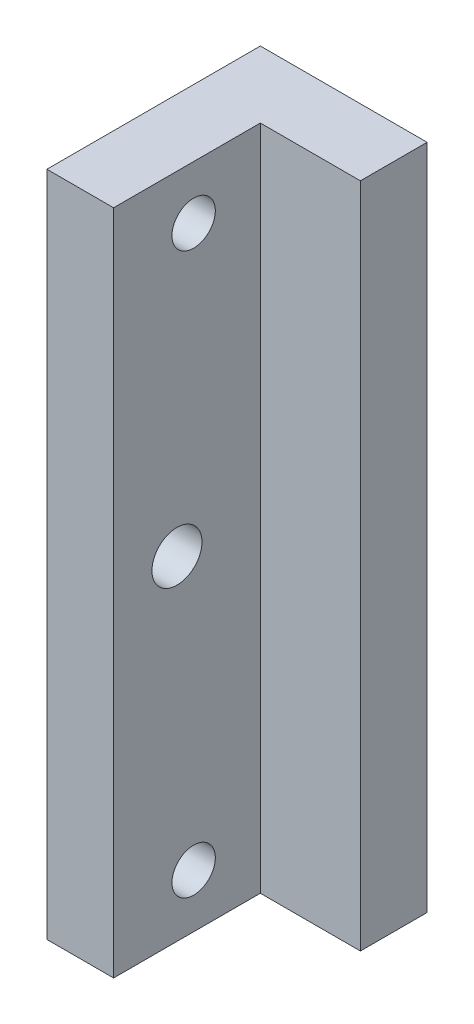
ISO-10303-21;
HEADER;
FILE_DESCRIPTION(('STEP AP214'),'2;1');
FILE_NAME('part.step','',(''),(''),'','','');
FILE_SCHEMA(('AUTOMOTIVE_DESIGN { 1 0 10303 214 1 1 1 1 }'));
ENDSEC;
DATA;
#1=APPLICATION_CONTEXT('core data for automotive mechanical design processes');
#2=APPLICATION_PROTOCOL_DEFINITION('international standard','automotive_design',2000,#1);
#3=PRODUCT_CONTEXT('',#1,'mechanical');
#4=PRODUCT('Part','Part','',(#3));
#5=PRODUCT_RELATED_PRODUCT_CATEGORY('part','',(#4));
#6=PRODUCT_DEFINITION_FORMATION('','',#4);
#7=PRODUCT_DEFINITION_CONTEXT('part definition',#1,'design');
#8=PRODUCT_DEFINITION('design','',#6,#7);
#9=PRODUCT_DEFINITION_SHAPE('','',#8);
#10=(LENGTH_UNIT() NAMED_UNIT(*) SI_UNIT(.MILLI.,.METRE.));
#11=(NAMED_UNIT(*) PLANE_ANGLE_UNIT() SI_UNIT($,.RADIAN.));
#12=(NAMED_UNIT(*) SI_UNIT($,.STERADIAN.) SOLID_ANGLE_UNIT());
#13=UNCERTAINTY_MEASURE_WITH_UNIT(LENGTH_MEASURE(1.E-05),#10,'distance_accuracy_value','');
#14=(GEOMETRIC_REPRESENTATION_CONTEXT(3) GLOBAL_UNCERTAINTY_ASSIGNED_CONTEXT((#13)) GLOBAL_UNIT_ASSIGNED_CONTEXT((#10,
#11,#12)) REPRESENTATION_CONTEXT('',''));
#15=CARTESIAN_POINT('',(0.,0.,0.));
#16=DIRECTION('',(0.,0.,1.));
#17=DIRECTION('',(1.,0.,0.));
#18=AXIS2_PLACEMENT_3D('',#15,#16,#17);
#19=CARTESIAN_POINT('',(25.,50.,10.));
#20=DIRECTION('',(-1.,0.,0.));
#21=DIRECTION('',(0.,0.,1.));
#22=AXIS2_PLACEMENT_3D('',#19,#20,#21);
#23=PLANE('',#22);
#24=DIRECTION('',(0.,0.,-1.));
#25=VECTOR('',#24,1.);
#26=CARTESIAN_POINT('',(25.,-50.,10.));
#27=LINE('',#26,#25);
#28=CARTESIAN_POINT('',(25.,-50.,10.));
#29=VERTEX_POINT('',#28);
#30=CARTESIAN_POINT('',(25.,-50.,0.));
#31=VERTEX_POINT('',#30);
#32=EDGE_CURVE('E118',#29,#31,#27,.T.);
#33=ORIENTED_EDGE('',*,*,#32,.T.);
#34=DIRECTION('',(0.,-1.,0.));
#35=VECTOR('',#34,1.);
#36=CARTESIAN_POINT('',(25.,50.,0.));
#37=LINE('',#36,#35);
#38=CARTESIAN_POINT('',(25.,50.,0.));
#39=VERTEX_POINT('',#38);
#40=EDGE_CURVE('E11',#39,#31,#37,.T.);
#41=ORIENTED_EDGE('',*,*,#40,.F.);
#42=DIRECTION('',(0.,0.,-1.));
#43=VECTOR('',#42,1.);
#44=CARTESIAN_POINT('',(25.,50.,10.));
#45=LINE('',#44,#43);
#46=CARTESIAN_POINT('',(25.,50.,10.));
#47=VERTEX_POINT('',#46);
#48=EDGE_CURVE('E129',#47,#39,#45,.T.);
#49=ORIENTED_EDGE('',*,*,#48,.F.);
#50=DIRECTION('',(0.,-1.,0.));
#51=VECTOR('',#50,1.);
#52=CARTESIAN_POINT('',(25.,50.,10.));
#53=LINE('',#52,#51);
#54=EDGE_CURVE('E114',#47,#29,#53,.T.);
#55=ORIENTED_EDGE('',*,*,#54,.T.);
#56=EDGE_LOOP('',(#33,#41,#49,#55));
#57=FACE_BOUND('',#56,.T.);
#58=ADVANCED_FACE('F32',(#57),#23,.F.);
#59=CARTESIAN_POINT('',(25.,50.,0.));
#60=DIRECTION('',(0.,0.,1.));
#61=DIRECTION('',(1.,0.,0.));
#62=AXIS2_PLACEMENT_3D('',#59,#60,#61);
#63=PLANE('',#62);
#64=DIRECTION('',(-1.,0.,0.));
#65=VECTOR('',#64,1.);
#66=CARTESIAN_POINT('',(25.,-50.,0.));
#67=LINE('',#66,#65);
#68=CARTESIAN_POINT('',(0.,-50.,0.));
#69=VERTEX_POINT('',#68);
#70=EDGE_CURVE('E121',#31,#69,#67,.T.);
#71=ORIENTED_EDGE('',*,*,#70,.T.);
#72=DIRECTION('',(0.,-1.,0.));
#73=VECTOR('',#72,1.);
#74=CARTESIAN_POINT('',(0.,50.,0.));
#75=LINE('',#74,#73);
#76=CARTESIAN_POINT('',(0.,50.,0.));
#77=VERTEX_POINT('',#76);
#78=EDGE_CURVE('E41',#77,#69,#75,.T.);
#79=ORIENTED_EDGE('',*,*,#78,.F.);
#80=DIRECTION('',(-1.,0.,0.));
#81=VECTOR('',#80,1.);
#82=CARTESIAN_POINT('',(25.,50.,0.));
#83=LINE('',#82,#81);
#84=EDGE_CURVE('E87',#39,#77,#83,.T.);
#85=ORIENTED_EDGE('',*,*,#84,.F.);
#86=ORIENTED_EDGE('',*,*,#40,.T.);
#87=EDGE_LOOP('',(#71,#79,#85,#86));
#88=FACE_BOUND('',#87,.T.);
#89=ADVANCED_FACE('F155',(#88),#63,.F.);
#90=CARTESIAN_POINT('',(0.,50.,0.));
#91=DIRECTION('',(1.,0.,0.));
#92=DIRECTION('',(0.,0.,-1.));
#93=AXIS2_PLACEMENT_3D('',#90,#91,#92);
#94=PLANE('',#93);
#95=CARTESIAN_POINT('',(0.,0.,22.5));
#96=DIRECTION('',(-1.,0.,0.));
#97=DIRECTION('',(0.,0.,1.));
#98=AXIS2_PLACEMENT_3D('',#95,#96,#97);
#99=CIRCLE('',#98,3.75);
#100=CARTESIAN_POINT('',(0.,0.,26.25));
#101=VERTEX_POINT('',#100);
#102=EDGE_CURVE('E149',#101,#101,#99,.T.);
#103=ORIENTED_EDGE('',*,*,#102,.F.);
#104=EDGE_LOOP('',(#103));
#105=FACE_BOUND('',#104,.T.);
#106=CARTESIAN_POINT('',(0.,-42.,20.));
#107=DIRECTION('',(-1.,0.,0.));
#108=DIRECTION('',(0.,0.,1.));
#109=AXIS2_PLACEMENT_3D('',#106,#107,#108);
#110=CIRCLE('',#109,3.24999999999999);
#111=CARTESIAN_POINT('',(0.,-42.,23.25));
#112=VERTEX_POINT('',#111);
#113=EDGE_CURVE('E139',#112,#112,#110,.T.);
#114=ORIENTED_EDGE('',*,*,#113,.F.);
#115=EDGE_LOOP('',(#114));
#116=FACE_BOUND('',#115,.T.);
#117=CARTESIAN_POINT('',(0.,42.,20.));
#118=DIRECTION('',(-1.,0.,0.));
#119=DIRECTION('',(0.,0.,1.));
#120=AXIS2_PLACEMENT_3D('',#117,#118,#119);
#121=CIRCLE('',#120,3.24999999999999);
#122=CARTESIAN_POINT('',(0.,42.,23.25));
#123=VERTEX_POINT('',#122);
#124=EDGE_CURVE('E136',#123,#123,#121,.T.);
#125=ORIENTED_EDGE('',*,*,#124,.F.);
#126=EDGE_LOOP('',(#125));
#127=FACE_BOUND('',#126,.T.);
#128=DIRECTION('',(0.,0.,1.));
#129=VECTOR('',#128,1.);
#130=CARTESIAN_POINT('',(0.,-50.,0.));
#131=LINE('',#130,#129);
#132=CARTESIAN_POINT('',(0.,-50.,32.));
#133=VERTEX_POINT('',#132);
#134=EDGE_CURVE('E124',#69,#133,#131,.T.);
#135=ORIENTED_EDGE('',*,*,#134,.T.);
#136=DIRECTION('',(0.,-1.,0.));
#137=VECTOR('',#136,1.);
#138=CARTESIAN_POINT('',(0.,50.,32.));
#139=LINE('',#138,#137);
#140=CARTESIAN_POINT('',(0.,50.,32.));
#141=VERTEX_POINT('',#140);
#142=EDGE_CURVE('E109',#141,#133,#139,.T.);
#143=ORIENTED_EDGE('',*,*,#142,.F.);
#144=DIRECTION('',(0.,0.,1.));
#145=VECTOR('',#144,1.);
#146=CARTESIAN_POINT('',(0.,50.,0.));
#147=LINE('',#146,#145);
#148=EDGE_CURVE('E100',#77,#141,#147,.T.);
#149=ORIENTED_EDGE('',*,*,#148,.F.);
#150=ORIENTED_EDGE('',*,*,#78,.T.);
#151=EDGE_LOOP('',(#135,#143,#149,#150));
#152=FACE_BOUND('',#151,.T.);
#153=ADVANCED_FACE('F158',(#105,#116,#127,#152),#94,.F.);
#154=CARTESIAN_POINT('',(0.,50.,32.));
#155=DIRECTION('',(0.,0.,-1.));
#156=DIRECTION('',(-1.,0.,0.));
#157=AXIS2_PLACEMENT_3D('',#154,#155,#156);
#158=PLANE('',#157);
#159=DIRECTION('',(1.,0.,0.));
#160=VECTOR('',#159,1.);
#161=CARTESIAN_POINT('',(0.,-50.,32.));
#162=LINE('',#161,#160);
#163=CARTESIAN_POINT('',(10.,-50.,32.));
#164=VERTEX_POINT('',#163);
#165=EDGE_CURVE('E108',#133,#164,#162,.T.);
#166=ORIENTED_EDGE('',*,*,#165,.T.);
#167=DIRECTION('',(0.,-1.,0.));
#168=VECTOR('',#167,1.);
#169=CARTESIAN_POINT('',(10.,50.,32.));
#170=LINE('',#169,#168);
#171=CARTESIAN_POINT('',(10.,50.,32.));
#172=VERTEX_POINT('',#171);
#173=EDGE_CURVE('E105',#172,#164,#170,.T.);
#174=ORIENTED_EDGE('',*,*,#173,.F.);
#175=DIRECTION('',(1.,0.,0.));
#176=VECTOR('',#175,1.);
#177=CARTESIAN_POINT('',(0.,50.,32.));
#178=LINE('',#177,#176);
#179=EDGE_CURVE('E94',#141,#172,#178,.T.);
#180=ORIENTED_EDGE('',*,*,#179,.F.);
#181=ORIENTED_EDGE('',*,*,#142,.T.);
#182=EDGE_LOOP('',(#166,#174,#180,#181));
#183=FACE_BOUND('',#182,.T.);
#184=ADVANCED_FACE('F106',(#183),#158,.F.);
#185=CARTESIAN_POINT('',(10.,50.,32.));
#186=DIRECTION('',(-1.,0.,0.));
#187=DIRECTION('',(0.,0.,1.));
#188=AXIS2_PLACEMENT_3D('',#185,#186,#187);
#189=PLANE('',#188);
#190=CARTESIAN_POINT('',(10.,0.,22.5));
#191=DIRECTION('',(-1.,0.,0.));
#192=DIRECTION('',(0.,0.,1.));
#193=AXIS2_PLACEMENT_3D('',#190,#191,#192);
#194=CIRCLE('',#193,3.75);
#195=CARTESIAN_POINT('',(10.,0.,26.25));
#196=VERTEX_POINT('',#195);
#197=EDGE_CURVE('E35',#196,#196,#194,.T.);
#198=ORIENTED_EDGE('',*,*,#197,.T.);
#199=EDGE_LOOP('',(#198));
#200=FACE_BOUND('',#199,.T.);
#201=CARTESIAN_POINT('',(10.,-42.,20.));
#202=DIRECTION('',(-1.,0.,0.));
#203=DIRECTION('',(0.,0.,1.));
#204=AXIS2_PLACEMENT_3D('',#201,#202,#203);
#205=CIRCLE('',#204,3.24999999999999);
#206=CARTESIAN_POINT('',(10.,-42.,23.25));
#207=VERTEX_POINT('',#206);
#208=EDGE_CURVE('E137',#207,#207,#205,.T.);
#209=ORIENTED_EDGE('',*,*,#208,.T.);
#210=EDGE_LOOP('',(#209));
#211=FACE_BOUND('',#210,.T.);
#212=CARTESIAN_POINT('',(10.,42.,20.));
#213=DIRECTION('',(-1.,0.,0.));
#214=DIRECTION('',(0.,0.,1.));
#215=AXIS2_PLACEMENT_3D('',#212,#213,#214);
#216=CIRCLE('',#215,3.24999999999999);
#217=CARTESIAN_POINT('',(10.,42.,23.25));
#218=VERTEX_POINT('',#217);
#219=EDGE_CURVE('E122',#218,#218,#216,.T.);
#220=ORIENTED_EDGE('',*,*,#219,.T.);
#221=EDGE_LOOP('',(#220));
#222=FACE_BOUND('',#221,.T.);
#223=DIRECTION('',(0.,0.,-1.));
#224=VECTOR('',#223,1.);
#225=CARTESIAN_POINT('',(10.,-50.,32.));
#226=LINE('',#225,#224);
#227=CARTESIAN_POINT('',(10.,-50.,10.));
#228=VERTEX_POINT('',#227);
#229=EDGE_CURVE('E73',#164,#228,#226,.T.);
#230=ORIENTED_EDGE('',*,*,#229,.T.);
#231=DIRECTION('',(0.,-1.,0.));
#232=VECTOR('',#231,1.);
#233=CARTESIAN_POINT('',(10.,50.,10.));
#234=LINE('',#233,#232);
#235=CARTESIAN_POINT('',(10.,50.,10.));
#236=VERTEX_POINT('',#235);
#237=EDGE_CURVE('E110',#236,#228,#234,.T.);
#238=ORIENTED_EDGE('',*,*,#237,.F.);
#239=DIRECTION('',(0.,0.,-1.));
#240=VECTOR('',#239,1.);
#241=CARTESIAN_POINT('',(10.,50.,32.));
#242=LINE('',#241,#240);
#243=EDGE_CURVE('E98',#172,#236,#242,.T.);
#244=ORIENTED_EDGE('',*,*,#243,.F.);
#245=ORIENTED_EDGE('',*,*,#173,.T.);
#246=EDGE_LOOP('',(#230,#238,#244,#245));
#247=FACE_BOUND('',#246,.T.);
#248=ADVANCED_FACE('F112',(#200,#211,#222,#247),#189,.F.);
#249=CARTESIAN_POINT('',(10.,50.,10.));
#250=DIRECTION('',(0.,0.,-1.));
#251=DIRECTION('',(-1.,0.,0.));
#252=AXIS2_PLACEMENT_3D('',#249,#250,#251);
#253=PLANE('',#252);
#254=DIRECTION('',(1.,0.,0.));
#255=VECTOR('',#254,1.);
#256=CARTESIAN_POINT('',(10.,-50.,10.));
#257=LINE('',#256,#255);
#258=EDGE_CURVE('E79',#228,#29,#257,.T.);
#259=ORIENTED_EDGE('',*,*,#258,.T.);
#260=ORIENTED_EDGE('',*,*,#54,.F.);
#261=DIRECTION('',(1.,0.,0.));
#262=VECTOR('',#261,1.);
#263=CARTESIAN_POINT('',(10.,50.,10.));
#264=LINE('',#263,#262);
#265=EDGE_CURVE('E50',#236,#47,#264,.T.);
#266=ORIENTED_EDGE('',*,*,#265,.F.);
#267=ORIENTED_EDGE('',*,*,#237,.T.);
#268=EDGE_LOOP('',(#259,#260,#266,#267));
#269=FACE_BOUND('',#268,.T.);
#270=ADVANCED_FACE('F163',(#269),#253,.F.);
#271=CARTESIAN_POINT('',(25.,50.,0.));
#272=DIRECTION('',(0.,1.,0.));
#273=DIRECTION('',(0.,0.,1.));
#274=AXIS2_PLACEMENT_3D('',#271,#272,#273);
#275=PLANE('',#274);
#276=ORIENTED_EDGE('',*,*,#48,.T.);
#277=ORIENTED_EDGE('',*,*,#84,.T.);
#278=ORIENTED_EDGE('',*,*,#148,.T.);
#279=ORIENTED_EDGE('',*,*,#179,.T.);
#280=ORIENTED_EDGE('',*,*,#243,.T.);
#281=ORIENTED_EDGE('',*,*,#265,.T.);
#282=EDGE_LOOP('',(#276,#277,#278,#279,#280,#281));
#283=FACE_BOUND('',#282,.T.);
#284=ADVANCED_FACE('F96',(#283),#275,.T.);
#285=CARTESIAN_POINT('',(25.,-50.,0.));
#286=DIRECTION('',(0.,1.,0.));
#287=DIRECTION('',(0.,0.,1.));
#288=AXIS2_PLACEMENT_3D('',#285,#286,#287);
#289=PLANE('',#288);
#290=ORIENTED_EDGE('',*,*,#32,.F.);
#291=ORIENTED_EDGE('',*,*,#258,.F.);
#292=ORIENTED_EDGE('',*,*,#229,.F.);
#293=ORIENTED_EDGE('',*,*,#165,.F.);
#294=ORIENTED_EDGE('',*,*,#134,.F.);
#295=ORIENTED_EDGE('',*,*,#70,.F.);
#296=EDGE_LOOP('',(#290,#291,#292,#293,#294,#295));
#297=FACE_BOUND('',#296,.T.);
#298=ADVANCED_FACE('F161',(#297),#289,.F.);
#299=CARTESIAN_POINT('',(0.,42.,20.));
#300=DIRECTION('',(-1.,0.,0.));
#301=DIRECTION('',(0.,0.,1.));
#302=AXIS2_PLACEMENT_3D('',#299,#300,#301);
#303=CYLINDRICAL_SURFACE('',#302,3.24999999999999);
#304=ORIENTED_EDGE('',*,*,#124,.T.);
#305=EDGE_LOOP('',(#304));
#306=FACE_BOUND('',#305,.T.);
#307=ORIENTED_EDGE('',*,*,#219,.F.);
#308=EDGE_LOOP('',(#307));
#309=FACE_BOUND('',#308,.T.);
#310=ADVANCED_FACE('F216',(#306,#309),#303,.F.);
#311=CARTESIAN_POINT('',(0.,-42.,20.));
#312=DIRECTION('',(-1.,0.,0.));
#313=DIRECTION('',(0.,0.,1.));
#314=AXIS2_PLACEMENT_3D('',#311,#312,#313);
#315=CYLINDRICAL_SURFACE('',#314,3.24999999999999);
#316=ORIENTED_EDGE('',*,*,#113,.T.);
#317=EDGE_LOOP('',(#316));
#318=FACE_BOUND('',#317,.T.);
#319=ORIENTED_EDGE('',*,*,#208,.F.);
#320=EDGE_LOOP('',(#319));
#321=FACE_BOUND('',#320,.T.);
#322=ADVANCED_FACE('F206',(#318,#321),#315,.F.);
#323=CARTESIAN_POINT('',(25.,0.,22.5));
#324=DIRECTION('',(-1.,0.,0.));
#325=DIRECTION('',(0.,0.,1.));
#326=AXIS2_PLACEMENT_3D('',#323,#324,#325);
#327=CYLINDRICAL_SURFACE('',#326,3.75);
#328=ORIENTED_EDGE('',*,*,#102,.T.);
#329=EDGE_LOOP('',(#328));
#330=FACE_BOUND('',#329,.T.);
#331=ORIENTED_EDGE('',*,*,#197,.F.);
#332=EDGE_LOOP('',(#331));
#333=FACE_BOUND('',#332,.T.);
#334=ADVANCED_FACE('F202',(#330,#333),#327,.F.);
#335=CLOSED_SHELL('',(#58,#89,#153,#184,#248,#270,#284,#298,#310,#322,#334));
#336=MANIFOLD_SOLID_BREP('B2',#335);
#337=ADVANCED_BREP_SHAPE_REPRESENTATION('',(#18,#336),#14);
#338=SHAPE_DEFINITION_REPRESENTATION(#9,#337);
ENDSEC;
END-ISO-10303-21;
